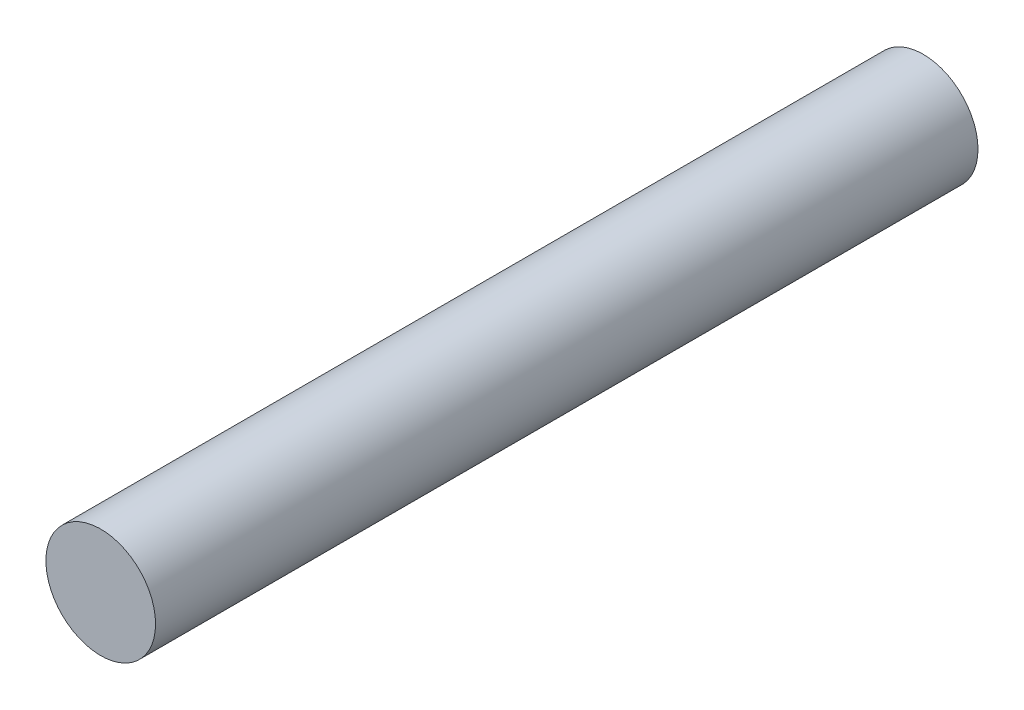
ISO-10303-21;
HEADER;
FILE_DESCRIPTION(('STEP AP214'),'2;1');
FILE_NAME('part.step','',(''),(''),'','','');
FILE_SCHEMA(('AUTOMOTIVE_DESIGN { 1 0 10303 214 1 1 1 1 }'));
ENDSEC;
DATA;
#1=APPLICATION_CONTEXT('core data for automotive mechanical design processes');
#2=APPLICATION_PROTOCOL_DEFINITION('international standard','automotive_design',2000,#1);
#3=PRODUCT_CONTEXT('',#1,'mechanical');
#4=PRODUCT('Part','Part','',(#3));
#5=PRODUCT_RELATED_PRODUCT_CATEGORY('part','',(#4));
#6=PRODUCT_DEFINITION_FORMATION('','',#4);
#7=PRODUCT_DEFINITION_CONTEXT('part definition',#1,'design');
#8=PRODUCT_DEFINITION('design','',#6,#7);
#9=PRODUCT_DEFINITION_SHAPE('','',#8);
#10=(LENGTH_UNIT() NAMED_UNIT(*) SI_UNIT(.MILLI.,.METRE.));
#11=(NAMED_UNIT(*) PLANE_ANGLE_UNIT() SI_UNIT($,.RADIAN.));
#12=(NAMED_UNIT(*) SI_UNIT($,.STERADIAN.) SOLID_ANGLE_UNIT());
#13=UNCERTAINTY_MEASURE_WITH_UNIT(LENGTH_MEASURE(1.E-05),#10,'distance_accuracy_value','');
#14=(GEOMETRIC_REPRESENTATION_CONTEXT(3) GLOBAL_UNCERTAINTY_ASSIGNED_CONTEXT((#13)) GLOBAL_UNIT_ASSIGNED_CONTEXT((#10,
#11,#12)) REPRESENTATION_CONTEXT('',''));
#15=CARTESIAN_POINT('',(0.,0.,0.));
#16=DIRECTION('',(0.,0.,1.));
#17=DIRECTION('',(1.,0.,0.));
#18=AXIS2_PLACEMENT_3D('',#15,#16,#17);
#19=CARTESIAN_POINT('',(0.,0.,150.));
#20=DIRECTION('',(0.,0.,-1.));
#21=DIRECTION('',(-1.,0.,0.));
#22=AXIS2_PLACEMENT_3D('',#19,#20,#21);
#23=CYLINDRICAL_SURFACE('',#22,10.);
#24=CARTESIAN_POINT('',(0.,0.,150.));
#25=DIRECTION('',(0.,0.,1.));
#26=DIRECTION('',(1.,0.,0.));
#27=AXIS2_PLACEMENT_3D('',#24,#25,#26);
#28=CIRCLE('',#27,10.);
#29=CARTESIAN_POINT('',(10.,0.,150.));
#30=VERTEX_POINT('',#29);
#31=EDGE_CURVE('E10',#30,#30,#28,.T.);
#32=ORIENTED_EDGE('',*,*,#31,.F.);
#33=EDGE_LOOP('',(#32));
#34=FACE_BOUND('',#33,.T.);
#35=CARTESIAN_POINT('',(0.,0.,0.));
#36=DIRECTION('',(0.,0.,1.));
#37=DIRECTION('',(1.,0.,0.));
#38=AXIS2_PLACEMENT_3D('',#35,#36,#37);
#39=CIRCLE('',#38,10.);
#40=CARTESIAN_POINT('',(10.,0.,0.));
#41=VERTEX_POINT('',#40);
#42=EDGE_CURVE('E44',#41,#41,#39,.T.);
#43=ORIENTED_EDGE('',*,*,#42,.T.);
#44=EDGE_LOOP('',(#43));
#45=FACE_BOUND('',#44,.T.);
#46=ADVANCED_FACE('F41',(#34,#45),#23,.T.);
#47=CARTESIAN_POINT('',(0.,0.,150.));
#48=DIRECTION('',(0.,0.,1.));
#49=DIRECTION('',(1.,0.,0.));
#50=AXIS2_PLACEMENT_3D('',#47,#48,#49);
#51=PLANE('',#50);
#52=ORIENTED_EDGE('',*,*,#31,.T.);
#53=EDGE_LOOP('',(#52));
#54=FACE_BOUND('',#53,.T.);
#55=ADVANCED_FACE('F56',(#54),#51,.T.);
#56=CARTESIAN_POINT('',(0.,0.,0.));
#57=DIRECTION('',(0.,0.,1.));
#58=DIRECTION('',(1.,0.,0.));
#59=AXIS2_PLACEMENT_3D('',#56,#57,#58);
#60=PLANE('',#59);
#61=ORIENTED_EDGE('',*,*,#42,.F.);
#62=EDGE_LOOP('',(#61));
#63=FACE_BOUND('',#62,.T.);
#64=ADVANCED_FACE('F54',(#63),#60,.F.);
#65=CLOSED_SHELL('',(#46,#55,#64));
#66=MANIFOLD_SOLID_BREP('B2',#65);
#67=ADVANCED_BREP_SHAPE_REPRESENTATION('',(#18,#66),#14);
#68=SHAPE_DEFINITION_REPRESENTATION(#9,#67);
ENDSEC;
END-ISO-10303-21;
